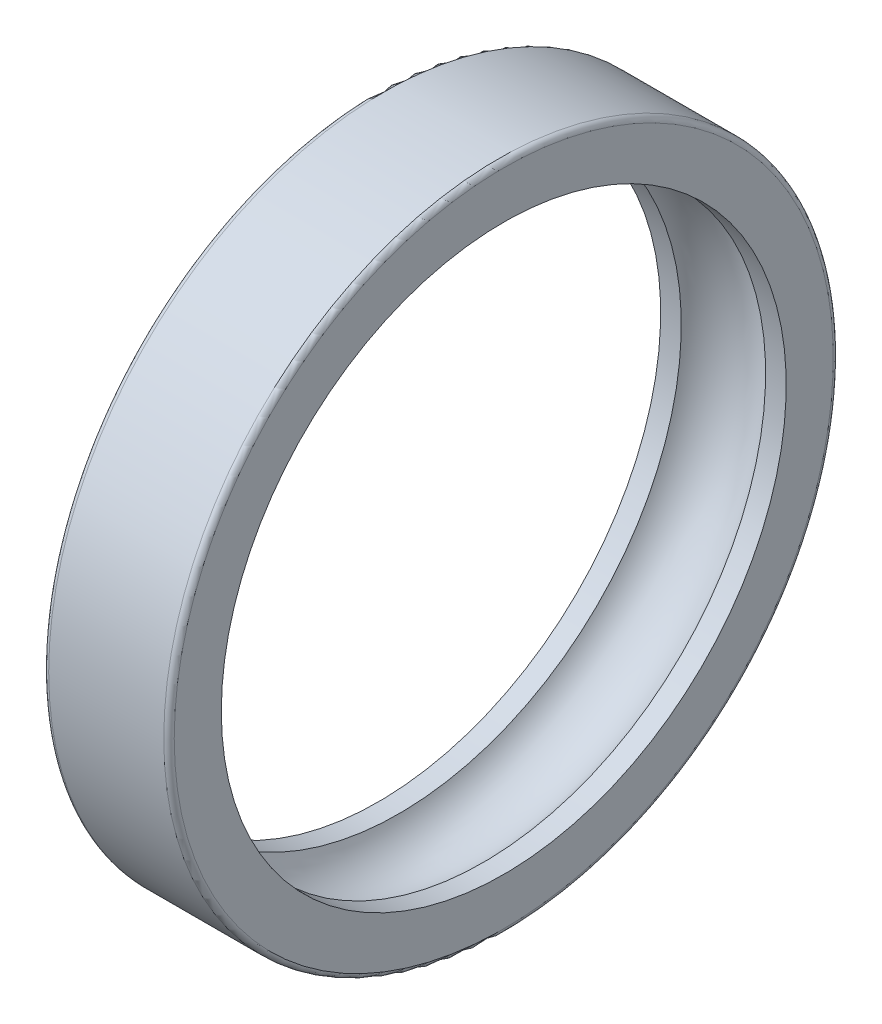
ISO-10303-21;
HEADER;
FILE_DESCRIPTION(('STEP AP214'),'2;1');
FILE_NAME('part.step','',(''),(''),'','','');
FILE_SCHEMA(('AUTOMOTIVE_DESIGN { 1 0 10303 214 1 1 1 1 }'));
ENDSEC;
DATA;
#1=APPLICATION_CONTEXT('core data for automotive mechanical design processes');
#2=APPLICATION_PROTOCOL_DEFINITION('international standard','automotive_design',2000,#1);
#3=PRODUCT_CONTEXT('',#1,'mechanical');
#4=PRODUCT('Part','Part','',(#3));
#5=PRODUCT_RELATED_PRODUCT_CATEGORY('part','',(#4));
#6=PRODUCT_DEFINITION_FORMATION('','',#4);
#7=PRODUCT_DEFINITION_CONTEXT('part definition',#1,'design');
#8=PRODUCT_DEFINITION('design','',#6,#7);
#9=PRODUCT_DEFINITION_SHAPE('','',#8);
#10=(LENGTH_UNIT() NAMED_UNIT(*) SI_UNIT(.MILLI.,.METRE.));
#11=(NAMED_UNIT(*) PLANE_ANGLE_UNIT() SI_UNIT($,.RADIAN.));
#12=(NAMED_UNIT(*) SI_UNIT($,.STERADIAN.) SOLID_ANGLE_UNIT());
#13=UNCERTAINTY_MEASURE_WITH_UNIT(LENGTH_MEASURE(1.E-05),#10,'distance_accuracy_value','');
#14=(GEOMETRIC_REPRESENTATION_CONTEXT(3) GLOBAL_UNCERTAINTY_ASSIGNED_CONTEXT((#13)) GLOBAL_UNIT_ASSIGNED_CONTEXT((#10,
#11,#12)) REPRESENTATION_CONTEXT('',''));
#15=CARTESIAN_POINT('',(0.,0.,0.));
#16=DIRECTION('',(0.,0.,1.));
#17=DIRECTION('',(1.,0.,0.));
#18=AXIS2_PLACEMENT_3D('',#15,#16,#17);
#19=CARTESIAN_POINT('',(0.,0.,0.));
#20=DIRECTION('',(-1.,0.,0.));
#21=DIRECTION('',(0.,0.,1.));
#22=AXIS2_PLACEMENT_3D('',#19,#20,#21);
#23=TOROIDAL_SURFACE('',#22,69.4444444444444,12.5);
#24=CARTESIAN_POINT('',(11.1975802059702,0.,0.));
#25=DIRECTION('',(-1.,0.,0.));
#26=DIRECTION('',(0.,0.,1.));
#27=AXIS2_PLACEMENT_3D('',#24,#25,#26);
#28=CIRCLE('',#27,75.);
#29=CARTESIAN_POINT('',(11.1975802059702,0.,75.));
#30=VERTEX_POINT('',#29);
#31=EDGE_CURVE('E68',#30,#30,#28,.T.);
#32=ORIENTED_EDGE('',*,*,#31,.F.);
#33=EDGE_LOOP('',(#32));
#34=FACE_BOUND('',#33,.T.);
#35=CARTESIAN_POINT('',(-11.1975802059702,0.,0.));
#36=DIRECTION('',(-1.,0.,0.));
#37=DIRECTION('',(0.,0.,1.));
#38=AXIS2_PLACEMENT_3D('',#35,#36,#37);
#39=CIRCLE('',#38,75.);
#40=CARTESIAN_POINT('',(-11.1975802059702,0.,75.));
#41=VERTEX_POINT('',#40);
#42=EDGE_CURVE('E80',#41,#41,#39,.T.);
#43=ORIENTED_EDGE('',*,*,#42,.T.);
#44=EDGE_LOOP('',(#43));
#45=FACE_BOUND('',#44,.T.);
#46=ADVANCED_FACE('F44',(#34,#45),#23,.F.);
#47=CARTESIAN_POINT('',(-23.2955562859267,0.,0.));
#48=DIRECTION('',(-1.,0.,0.));
#49=DIRECTION('',(0.,0.,1.));
#50=AXIS2_PLACEMENT_3D('',#47,#48,#49);
#51=CYLINDRICAL_SURFACE('',#50,75.);
#52=CARTESIAN_POINT('',(16.6666666666667,0.,0.));
#53=DIRECTION('',(-1.,0.,0.));
#54=DIRECTION('',(0.,0.,1.));
#55=AXIS2_PLACEMENT_3D('',#52,#53,#54);
#56=CIRCLE('',#55,75.);
#57=CARTESIAN_POINT('',(16.6666666666667,0.,75.));
#58=VERTEX_POINT('',#57);
#59=EDGE_CURVE('E72',#58,#58,#56,.T.);
#60=ORIENTED_EDGE('',*,*,#59,.F.);
#61=EDGE_LOOP('',(#60));
#62=FACE_BOUND('',#61,.T.);
#63=ORIENTED_EDGE('',*,*,#31,.T.);
#64=EDGE_LOOP('',(#63));
#65=FACE_BOUND('',#64,.T.);
#66=ADVANCED_FACE('F104',(#62,#65),#51,.F.);
#67=CARTESIAN_POINT('',(16.6666666666667,75.,0.));
#68=DIRECTION('',(-1.,0.,0.));
#69=DIRECTION('',(0.,0.,1.));
#70=AXIS2_PLACEMENT_3D('',#67,#68,#69);
#71=PLANE('',#70);
#72=CARTESIAN_POINT('',(16.6666666666667,0.,0.));
#73=DIRECTION('',(-1.,0.,0.));
#74=DIRECTION('',(0.,0.,1.));
#75=AXIS2_PLACEMENT_3D('',#72,#73,#74);
#76=CIRCLE('',#75,87.5);
#77=CARTESIAN_POINT('',(16.6666666666667,0.,87.5));
#78=VERTEX_POINT('',#77);
#79=EDGE_CURVE('E52',#78,#78,#76,.F.);
#80=ORIENTED_EDGE('',*,*,#79,.T.);
#81=EDGE_LOOP('',(#80));
#82=FACE_BOUND('',#81,.T.);
#83=ORIENTED_EDGE('',*,*,#59,.T.);
#84=EDGE_LOOP('',(#83));
#85=FACE_BOUND('',#84,.T.);
#86=ADVANCED_FACE('F100',(#82,#85),#71,.F.);
#87=CARTESIAN_POINT('',(-23.2955562859267,0.,0.));
#88=DIRECTION('',(-1.,0.,0.));
#89=DIRECTION('',(0.,0.,1.));
#90=AXIS2_PLACEMENT_3D('',#87,#88,#89);
#91=CYLINDRICAL_SURFACE('',#90,88.8888888888889);
#92=CARTESIAN_POINT('',(15.2777777777778,0.,0.));
#93=DIRECTION('',(-1.,0.,0.));
#94=DIRECTION('',(0.,0.,1.));
#95=AXIS2_PLACEMENT_3D('',#92,#93,#94);
#96=CIRCLE('',#95,88.8888888888889);
#97=CARTESIAN_POINT('',(15.2777777777778,0.,88.8888888888889));
#98=VERTEX_POINT('',#97);
#99=EDGE_CURVE('E57',#98,#98,#96,.T.);
#100=ORIENTED_EDGE('',*,*,#99,.T.);
#101=EDGE_LOOP('',(#100));
#102=FACE_BOUND('',#101,.T.);
#103=CARTESIAN_POINT('',(-15.2777777777778,0.,0.));
#104=DIRECTION('',(1.,0.,0.));
#105=DIRECTION('',(0.,0.,-1.));
#106=AXIS2_PLACEMENT_3D('',#103,#104,#105);
#107=CIRCLE('',#106,88.8888888888889);
#108=CARTESIAN_POINT('',(-15.2777777777778,0.,-88.8888888888889));
#109=VERTEX_POINT('',#108);
#110=EDGE_CURVE('E62',#109,#109,#107,.T.);
#111=ORIENTED_EDGE('',*,*,#110,.T.);
#112=EDGE_LOOP('',(#111));
#113=FACE_BOUND('',#112,.T.);
#114=ADVANCED_FACE('F95',(#102,#113),#91,.T.);
#115=CARTESIAN_POINT('',(-16.6666666666667,75.,0.));
#116=DIRECTION('',(1.,0.,0.));
#117=DIRECTION('',(0.,0.,-1.));
#118=AXIS2_PLACEMENT_3D('',#115,#116,#117);
#119=PLANE('',#118);
#120=CARTESIAN_POINT('',(-16.6666666666667,0.,0.));
#121=DIRECTION('',(1.,0.,0.));
#122=DIRECTION('',(0.,0.,-1.));
#123=AXIS2_PLACEMENT_3D('',#120,#121,#122);
#124=CIRCLE('',#123,87.5);
#125=CARTESIAN_POINT('',(-16.6666666666667,0.,-87.5));
#126=VERTEX_POINT('',#125);
#127=EDGE_CURVE('E10',#126,#126,#124,.F.);
#128=ORIENTED_EDGE('',*,*,#127,.T.);
#129=EDGE_LOOP('',(#128));
#130=FACE_BOUND('',#129,.T.);
#131=CARTESIAN_POINT('',(-16.6666666666667,0.,0.));
#132=DIRECTION('',(-1.,0.,0.));
#133=DIRECTION('',(0.,0.,1.));
#134=AXIS2_PLACEMENT_3D('',#131,#132,#133);
#135=CIRCLE('',#134,75.);
#136=CARTESIAN_POINT('',(-16.6666666666667,0.,75.));
#137=VERTEX_POINT('',#136);
#138=EDGE_CURVE('E76',#137,#137,#135,.T.);
#139=ORIENTED_EDGE('',*,*,#138,.F.);
#140=EDGE_LOOP('',(#139));
#141=FACE_BOUND('',#140,.T.);
#142=ADVANCED_FACE('F90',(#130,#141),#119,.F.);
#143=CARTESIAN_POINT('',(-23.2955562859267,0.,0.));
#144=DIRECTION('',(-1.,0.,0.));
#145=DIRECTION('',(0.,0.,1.));
#146=AXIS2_PLACEMENT_3D('',#143,#144,#145);
#147=CYLINDRICAL_SURFACE('',#146,75.);
#148=ORIENTED_EDGE('',*,*,#42,.F.);
#149=EDGE_LOOP('',(#148));
#150=FACE_BOUND('',#149,.T.);
#151=ORIENTED_EDGE('',*,*,#138,.T.);
#152=EDGE_LOOP('',(#151));
#153=FACE_BOUND('',#152,.T.);
#154=ADVANCED_FACE('F86',(#150,#153),#147,.F.);
#155=CARTESIAN_POINT('',(15.2777777777778,0.,0.));
#156=DIRECTION('',(-1.,0.,0.));
#157=DIRECTION('',(0.,0.,1.));
#158=AXIS2_PLACEMENT_3D('',#155,#156,#157);
#159=TOROIDAL_SURFACE('',#158,87.5,1.38888888888889);
#160=ORIENTED_EDGE('',*,*,#79,.F.);
#161=EDGE_LOOP('',(#160));
#162=FACE_BOUND('',#161,.T.);
#163=ORIENTED_EDGE('',*,*,#99,.F.);
#164=EDGE_LOOP('',(#163));
#165=FACE_BOUND('',#164,.T.);
#166=ADVANCED_FACE('F89',(#162,#165),#159,.T.);
#167=CARTESIAN_POINT('',(-15.2777777777778,0.,0.));
#168=DIRECTION('',(1.,0.,0.));
#169=DIRECTION('',(0.,0.,-1.));
#170=AXIS2_PLACEMENT_3D('',#167,#168,#169);
#171=TOROIDAL_SURFACE('',#170,87.5,1.38888888888889);
#172=ORIENTED_EDGE('',*,*,#110,.F.);
#173=EDGE_LOOP('',(#172));
#174=FACE_BOUND('',#173,.T.);
#175=ORIENTED_EDGE('',*,*,#127,.F.);
#176=EDGE_LOOP('',(#175));
#177=FACE_BOUND('',#176,.T.);
#178=ADVANCED_FACE('F46',(#174,#177),#171,.T.);
#179=CLOSED_SHELL('',(#46,#66,#86,#114,#142,#154,#166,#178));
#180=MANIFOLD_SOLID_BREP('B2',#179);
#181=ADVANCED_BREP_SHAPE_REPRESENTATION('',(#18,#180),#14);
#182=SHAPE_DEFINITION_REPRESENTATION(#9,#181);
ENDSEC;
END-ISO-10303-21;
